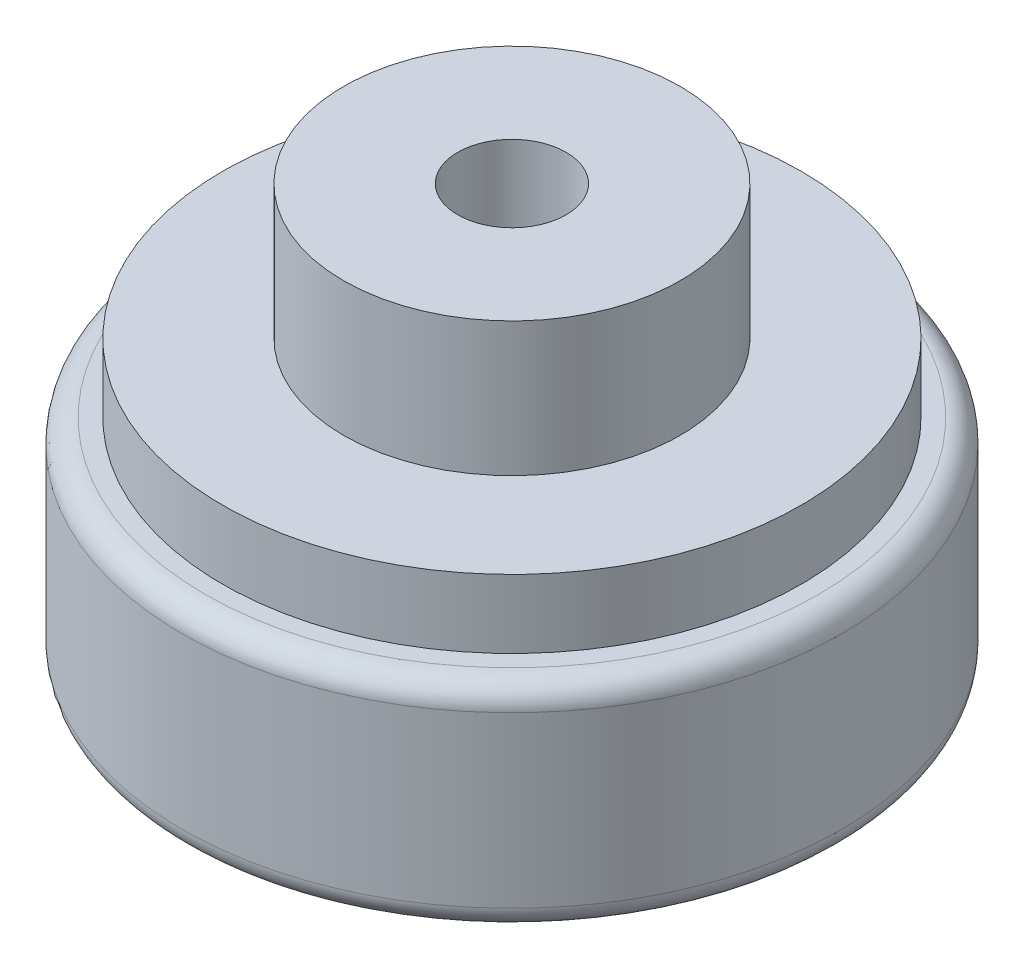
ISO-10303-21;
HEADER;
FILE_DESCRIPTION(('STEP AP214'),'2;1');
FILE_NAME('part.step','',(''),(''),'','','');
FILE_SCHEMA(('AUTOMOTIVE_DESIGN { 1 0 10303 214 1 1 1 1 }'));
ENDSEC;
DATA;
#1=APPLICATION_CONTEXT('core data for automotive mechanical design processes');
#2=APPLICATION_PROTOCOL_DEFINITION('international standard','automotive_design',2000,#1);
#3=PRODUCT_CONTEXT('',#1,'mechanical');
#4=PRODUCT('Part','Part','',(#3));
#5=PRODUCT_RELATED_PRODUCT_CATEGORY('part','',(#4));
#6=PRODUCT_DEFINITION_FORMATION('','',#4);
#7=PRODUCT_DEFINITION_CONTEXT('part definition',#1,'design');
#8=PRODUCT_DEFINITION('design','',#6,#7);
#9=PRODUCT_DEFINITION_SHAPE('','',#8);
#10=(LENGTH_UNIT() NAMED_UNIT(*) SI_UNIT(.MILLI.,.METRE.));
#11=(NAMED_UNIT(*) PLANE_ANGLE_UNIT() SI_UNIT($,.RADIAN.));
#12=(NAMED_UNIT(*) SI_UNIT($,.STERADIAN.) SOLID_ANGLE_UNIT());
#13=UNCERTAINTY_MEASURE_WITH_UNIT(LENGTH_MEASURE(1.E-05),#10,'distance_accuracy_value','');
#14=(GEOMETRIC_REPRESENTATION_CONTEXT(3) GLOBAL_UNCERTAINTY_ASSIGNED_CONTEXT((#13)) GLOBAL_UNIT_ASSIGNED_CONTEXT((#10,
#11,#12)) REPRESENTATION_CONTEXT('',''));
#15=CARTESIAN_POINT('',(0.,0.,0.));
#16=DIRECTION('',(0.,0.,1.));
#17=DIRECTION('',(1.,0.,0.));
#18=AXIS2_PLACEMENT_3D('',#15,#16,#17);
#19=CARTESIAN_POINT('',(0.,0.,0.));
#20=DIRECTION('',(0.,-1.,0.));
#21=DIRECTION('',(0.,0.,-1.));
#22=AXIS2_PLACEMENT_3D('',#19,#20,#21);
#23=CYLINDRICAL_SURFACE('',#22,6.0325);
#24=CARTESIAN_POINT('',(0.,-23.9268,0.));
#25=DIRECTION('',(0.,-1.,0.));
#26=DIRECTION('',(0.,0.,-1.));
#27=AXIS2_PLACEMENT_3D('',#24,#25,#26);
#28=CIRCLE('',#27,6.03250000000001);
#29=CARTESIAN_POINT('',(0.,-23.9268,-6.03250000000001));
#30=VERTEX_POINT('',#29);
#31=EDGE_CURVE('E10',#30,#30,#28,.T.);
#32=ORIENTED_EDGE('',*,*,#31,.T.);
#33=EDGE_LOOP('',(#32));
#34=FACE_BOUND('',#33,.T.);
#35=CARTESIAN_POINT('',(0.,22.5298,0.));
#36=DIRECTION('',(0.,-1.,0.));
#37=DIRECTION('',(0.,0.,-1.));
#38=AXIS2_PLACEMENT_3D('',#35,#36,#37);
#39=CIRCLE('',#38,6.0325);
#40=CARTESIAN_POINT('',(0.,22.5298,-6.0325));
#41=VERTEX_POINT('',#40);
#42=EDGE_CURVE('E69',#41,#41,#39,.T.);
#43=ORIENTED_EDGE('',*,*,#42,.F.);
#44=EDGE_LOOP('',(#43));
#45=FACE_BOUND('',#44,.T.);
#46=ADVANCED_FACE('F35',(#34,#45),#23,.F.);
#47=CARTESIAN_POINT('',(0.,-23.9268,0.));
#48=DIRECTION('',(0.,-1.,0.));
#49=DIRECTION('',(0.,0.,-1.));
#50=AXIS2_PLACEMENT_3D('',#47,#48,#49);
#51=PLANE('',#50);
#52=CARTESIAN_POINT('',(0.,-23.9268,0.));
#53=DIRECTION('',(0.,-1.,0.));
#54=DIRECTION('',(0.,0.,-1.));
#55=AXIS2_PLACEMENT_3D('',#52,#53,#54);
#56=CIRCLE('',#55,34.1376);
#57=CARTESIAN_POINT('',(0.,-23.9268,-34.1376));
#58=VERTEX_POINT('',#57);
#59=EDGE_CURVE('E41',#58,#58,#56,.T.);
#60=ORIENTED_EDGE('',*,*,#59,.T.);
#61=EDGE_LOOP('',(#60));
#62=FACE_BOUND('',#61,.T.);
#63=ORIENTED_EDGE('',*,*,#31,.F.);
#64=EDGE_LOOP('',(#63));
#65=FACE_BOUND('',#64,.T.);
#66=ADVANCED_FACE('F76',(#62,#65),#51,.T.);
#67=CARTESIAN_POINT('',(0.,-21.3868,0.));
#68=DIRECTION('',(0.,-1.,0.));
#69=DIRECTION('',(0.,0.,-1.));
#70=AXIS2_PLACEMENT_3D('',#67,#68,#69);
#71=TOROIDAL_SURFACE('',#70,34.1376,2.54);
#72=CARTESIAN_POINT('',(0.,-21.3868,0.));
#73=DIRECTION('',(0.,-1.,0.));
#74=DIRECTION('',(0.,0.,-1.));
#75=AXIS2_PLACEMENT_3D('',#72,#73,#74);
#76=CIRCLE('',#75,36.6776);
#77=CARTESIAN_POINT('',(0.,-21.3868,-36.6776));
#78=VERTEX_POINT('',#77);
#79=EDGE_CURVE('E45',#78,#78,#76,.T.);
#80=ORIENTED_EDGE('',*,*,#79,.T.);
#81=EDGE_LOOP('',(#80));
#82=FACE_BOUND('',#81,.T.);
#83=ORIENTED_EDGE('',*,*,#59,.F.);
#84=EDGE_LOOP('',(#83));
#85=FACE_BOUND('',#84,.T.);
#86=ADVANCED_FACE('F80',(#82,#85),#71,.T.);
#87=CARTESIAN_POINT('',(0.,0.,0.));
#88=DIRECTION('',(0.,-1.,0.));
#89=DIRECTION('',(0.,0.,-1.));
#90=AXIS2_PLACEMENT_3D('',#87,#88,#89);
#91=CYLINDRICAL_SURFACE('',#90,36.6776);
#92=CARTESIAN_POINT('',(0.,-2.54000000000002,0.));
#93=DIRECTION('',(0.,-1.,0.));
#94=DIRECTION('',(0.,0.,-1.));
#95=AXIS2_PLACEMENT_3D('',#92,#93,#94);
#96=CIRCLE('',#95,36.6776);
#97=CARTESIAN_POINT('',(0.,-2.54000000000002,-36.6776));
#98=VERTEX_POINT('',#97);
#99=EDGE_CURVE('E49',#98,#98,#96,.T.);
#100=ORIENTED_EDGE('',*,*,#99,.T.);
#101=EDGE_LOOP('',(#100));
#102=FACE_BOUND('',#101,.T.);
#103=ORIENTED_EDGE('',*,*,#79,.F.);
#104=EDGE_LOOP('',(#103));
#105=FACE_BOUND('',#104,.T.);
#106=ADVANCED_FACE('F84',(#102,#105),#91,.T.);
#107=CARTESIAN_POINT('',(0.,-2.54,0.));
#108=DIRECTION('',(0.,-1.,0.));
#109=DIRECTION('',(0.,0.,-1.));
#110=AXIS2_PLACEMENT_3D('',#107,#108,#109);
#111=TOROIDAL_SURFACE('',#110,34.1376,2.54);
#112=CARTESIAN_POINT('',(0.,0.,0.));
#113=DIRECTION('',(0.,-1.,0.));
#114=DIRECTION('',(0.,0.,-1.));
#115=AXIS2_PLACEMENT_3D('',#112,#113,#114);
#116=CIRCLE('',#115,34.1376);
#117=CARTESIAN_POINT('',(0.,0.,-34.1376));
#118=VERTEX_POINT('',#117);
#119=EDGE_CURVE('E54',#118,#118,#116,.T.);
#120=ORIENTED_EDGE('',*,*,#119,.T.);
#121=EDGE_LOOP('',(#120));
#122=FACE_BOUND('',#121,.T.);
#123=ORIENTED_EDGE('',*,*,#99,.F.);
#124=EDGE_LOOP('',(#123));
#125=FACE_BOUND('',#124,.T.);
#126=ADVANCED_FACE('F91',(#122,#125),#111,.T.);
#127=CARTESIAN_POINT('',(0.,0.,0.));
#128=DIRECTION('',(0.,1.,0.));
#129=DIRECTION('',(0.,0.,1.));
#130=AXIS2_PLACEMENT_3D('',#127,#128,#129);
#131=PLANE('',#130);
#132=CARTESIAN_POINT('',(0.,0.,0.));
#133=DIRECTION('',(0.,-1.,0.));
#134=DIRECTION('',(0.,0.,-1.));
#135=AXIS2_PLACEMENT_3D('',#132,#133,#134);
#136=CIRCLE('',#135,32.1945);
#137=CARTESIAN_POINT('',(0.,0.,-32.1945));
#138=VERTEX_POINT('',#137);
#139=EDGE_CURVE('E57',#138,#138,#136,.T.);
#140=ORIENTED_EDGE('',*,*,#139,.T.);
#141=EDGE_LOOP('',(#140));
#142=FACE_BOUND('',#141,.T.);
#143=ORIENTED_EDGE('',*,*,#119,.F.);
#144=EDGE_LOOP('',(#143));
#145=FACE_BOUND('',#144,.T.);
#146=ADVANCED_FACE('F95',(#142,#145),#131,.T.);
#147=CARTESIAN_POINT('',(0.,0.,0.));
#148=DIRECTION('',(0.,-1.,0.));
#149=DIRECTION('',(0.,0.,-1.));
#150=AXIS2_PLACEMENT_3D('',#147,#148,#149);
#151=CYLINDRICAL_SURFACE('',#150,32.1945);
#152=CARTESIAN_POINT('',(0.,7.62,0.));
#153=DIRECTION('',(0.,-1.,0.));
#154=DIRECTION('',(0.,0.,-1.));
#155=AXIS2_PLACEMENT_3D('',#152,#153,#154);
#156=CIRCLE('',#155,32.1945);
#157=CARTESIAN_POINT('',(0.,7.62,-32.1945));
#158=VERTEX_POINT('',#157);
#159=EDGE_CURVE('E60',#158,#158,#156,.T.);
#160=ORIENTED_EDGE('',*,*,#159,.T.);
#161=EDGE_LOOP('',(#160));
#162=FACE_BOUND('',#161,.T.);
#163=ORIENTED_EDGE('',*,*,#139,.F.);
#164=EDGE_LOOP('',(#163));
#165=FACE_BOUND('',#164,.T.);
#166=ADVANCED_FACE('F99',(#162,#165),#151,.T.);
#167=CARTESIAN_POINT('',(0.,7.62,0.));
#168=DIRECTION('',(0.,-1.,0.));
#169=DIRECTION('',(0.,0.,-1.));
#170=AXIS2_PLACEMENT_3D('',#167,#168,#169);
#171=PLANE('',#170);
#172=ORIENTED_EDGE('',*,*,#159,.F.);
#173=EDGE_LOOP('',(#172));
#174=FACE_BOUND('',#173,.T.);
#175=CARTESIAN_POINT('',(0.,7.62,0.));
#176=DIRECTION('',(0.,-1.,0.));
#177=DIRECTION('',(0.,0.,-1.));
#178=AXIS2_PLACEMENT_3D('',#175,#176,#177);
#179=CIRCLE('',#178,18.7325);
#180=CARTESIAN_POINT('',(0.,7.62,-18.7325));
#181=VERTEX_POINT('',#180);
#182=EDGE_CURVE('E63',#181,#181,#179,.T.);
#183=ORIENTED_EDGE('',*,*,#182,.T.);
#184=EDGE_LOOP('',(#183));
#185=FACE_BOUND('',#184,.T.);
#186=ADVANCED_FACE('F103',(#174,#185),#171,.F.);
#187=CARTESIAN_POINT('',(0.,0.,0.));
#188=DIRECTION('',(0.,-1.,0.));
#189=DIRECTION('',(0.,0.,-1.));
#190=AXIS2_PLACEMENT_3D('',#187,#188,#189);
#191=CYLINDRICAL_SURFACE('',#190,18.7325);
#192=ORIENTED_EDGE('',*,*,#182,.F.);
#193=EDGE_LOOP('',(#192));
#194=FACE_BOUND('',#193,.T.);
#195=CARTESIAN_POINT('',(0.,22.5298,0.));
#196=DIRECTION('',(0.,-1.,0.));
#197=DIRECTION('',(0.,0.,-1.));
#198=AXIS2_PLACEMENT_3D('',#195,#196,#197);
#199=CIRCLE('',#198,18.7325);
#200=CARTESIAN_POINT('',(0.,22.5298,-18.7325));
#201=VERTEX_POINT('',#200);
#202=EDGE_CURVE('E66',#201,#201,#199,.T.);
#203=ORIENTED_EDGE('',*,*,#202,.T.);
#204=EDGE_LOOP('',(#203));
#205=FACE_BOUND('',#204,.T.);
#206=ADVANCED_FACE('F107',(#194,#205),#191,.T.);
#207=CARTESIAN_POINT('',(0.,22.5298,0.));
#208=DIRECTION('',(0.,-1.,0.));
#209=DIRECTION('',(0.,0.,-1.));
#210=AXIS2_PLACEMENT_3D('',#207,#208,#209);
#211=PLANE('',#210);
#212=ORIENTED_EDGE('',*,*,#202,.F.);
#213=EDGE_LOOP('',(#212));
#214=FACE_BOUND('',#213,.T.);
#215=ORIENTED_EDGE('',*,*,#42,.T.);
#216=EDGE_LOOP('',(#215));
#217=FACE_BOUND('',#216,.T.);
#218=ADVANCED_FACE('F73',(#214,#217),#211,.F.);
#219=CLOSED_SHELL('',(#46,#66,#86,#106,#126,#146,#166,#186,#206,#218));
#220=MANIFOLD_SOLID_BREP('B2',#219);
#221=ADVANCED_BREP_SHAPE_REPRESENTATION('',(#18,#220),#14);
#222=SHAPE_DEFINITION_REPRESENTATION(#9,#221);
ENDSEC;
END-ISO-10303-21;
